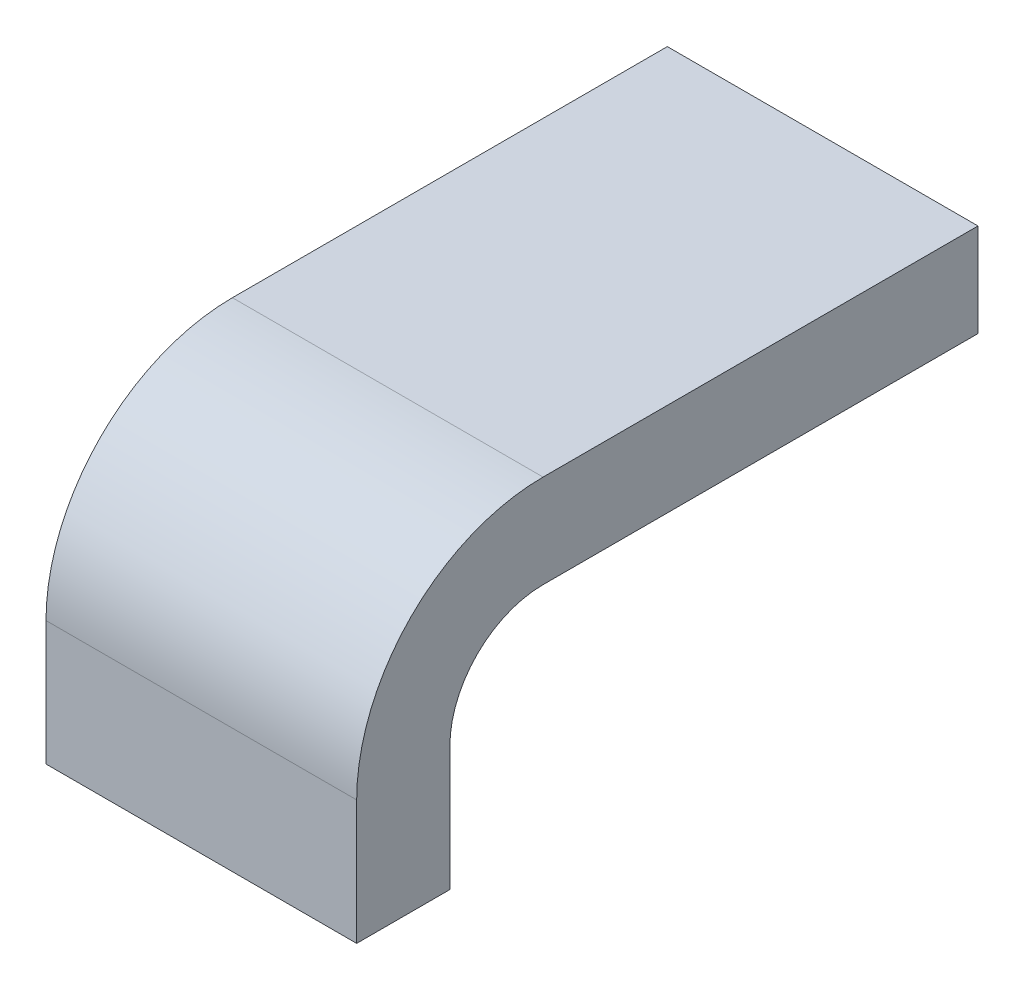
ISO-10303-21;
HEADER;
FILE_DESCRIPTION(('STEP AP214'),'2;1');
FILE_NAME('part.step','',(''),(''),'','','');
FILE_SCHEMA(('AUTOMOTIVE_DESIGN { 1 0 10303 214 1 1 1 1 }'));
ENDSEC;
DATA;
#1=APPLICATION_CONTEXT('core data for automotive mechanical design processes');
#2=APPLICATION_PROTOCOL_DEFINITION('international standard','automotive_design',2000,#1);
#3=PRODUCT_CONTEXT('',#1,'mechanical');
#4=PRODUCT('Part','Part','',(#3));
#5=PRODUCT_RELATED_PRODUCT_CATEGORY('part','',(#4));
#6=PRODUCT_DEFINITION_FORMATION('','',#4);
#7=PRODUCT_DEFINITION_CONTEXT('part definition',#1,'design');
#8=PRODUCT_DEFINITION('design','',#6,#7);
#9=PRODUCT_DEFINITION_SHAPE('','',#8);
#10=(LENGTH_UNIT() NAMED_UNIT(*) SI_UNIT(.MILLI.,.METRE.));
#11=(NAMED_UNIT(*) PLANE_ANGLE_UNIT() SI_UNIT($,.RADIAN.));
#12=(NAMED_UNIT(*) SI_UNIT($,.STERADIAN.) SOLID_ANGLE_UNIT());
#13=UNCERTAINTY_MEASURE_WITH_UNIT(LENGTH_MEASURE(1.E-05),#10,'distance_accuracy_value','');
#14=(GEOMETRIC_REPRESENTATION_CONTEXT(3) GLOBAL_UNCERTAINTY_ASSIGNED_CONTEXT((#13)) GLOBAL_UNIT_ASSIGNED_CONTEXT((#10,
#11,#12)) REPRESENTATION_CONTEXT('',''));
#15=CARTESIAN_POINT('',(0.,0.,0.));
#16=DIRECTION('',(0.,0.,1.));
#17=DIRECTION('',(1.,0.,0.));
#18=AXIS2_PLACEMENT_3D('',#15,#16,#17);
#19=CARTESIAN_POINT('',(5.,2.28436018957346,-5.260663507109));
#20=DIRECTION('',(0.,0.,1.));
#21=DIRECTION('',(1.,0.,0.));
#22=AXIS2_PLACEMENT_3D('',#19,#20,#21);
#23=PLANE('',#22);
#24=DIRECTION('',(0.,1.,0.));
#25=VECTOR('',#24,1.);
#26=CARTESIAN_POINT('',(-5.,2.28436018957346,-5.260663507109));
#27=LINE('',#26,#25);
#28=CARTESIAN_POINT('',(-5.,2.28436018957346,-5.260663507109));
#29=VERTEX_POINT('',#28);
#30=CARTESIAN_POINT('',(-5.,5.28436018957346,-5.260663507109));
#31=VERTEX_POINT('',#30);
#32=EDGE_CURVE('E128',#29,#31,#27,.T.);
#33=ORIENTED_EDGE('',*,*,#32,.T.);
#34=DIRECTION('',(-1.,0.,0.));
#35=VECTOR('',#34,1.);
#36=CARTESIAN_POINT('',(5.,5.28436018957346,-5.260663507109));
#37=LINE('',#36,#35);
#38=CARTESIAN_POINT('',(5.,5.28436018957346,-5.260663507109));
#39=VERTEX_POINT('',#38);
#40=EDGE_CURVE('E11',#39,#31,#37,.T.);
#41=ORIENTED_EDGE('',*,*,#40,.F.);
#42=DIRECTION('',(0.,1.,0.));
#43=VECTOR('',#42,1.);
#44=CARTESIAN_POINT('',(5.,2.28436018957346,-5.260663507109));
#45=LINE('',#44,#43);
#46=CARTESIAN_POINT('',(5.,2.28436018957346,-5.260663507109));
#47=VERTEX_POINT('',#46);
#48=EDGE_CURVE('E143',#47,#39,#45,.T.);
#49=ORIENTED_EDGE('',*,*,#48,.F.);
#50=DIRECTION('',(-1.,0.,0.));
#51=VECTOR('',#50,1.);
#52=CARTESIAN_POINT('',(5.,2.28436018957346,-5.260663507109));
#53=LINE('',#52,#51);
#54=EDGE_CURVE('E124',#47,#29,#53,.T.);
#55=ORIENTED_EDGE('',*,*,#54,.T.);
#56=EDGE_LOOP('',(#33,#41,#49,#55));
#57=FACE_BOUND('',#56,.T.);
#58=ADVANCED_FACE('F33',(#57),#23,.F.);
#59=CARTESIAN_POINT('',(5.,5.28436018957346,-5.260663507109));
#60=DIRECTION('',(0.,-1.,0.));
#61=DIRECTION('',(0.,0.,-1.));
#62=AXIS2_PLACEMENT_3D('',#59,#60,#61);
#63=PLANE('',#62);
#64=DIRECTION('',(0.,0.,1.));
#65=VECTOR('',#64,1.);
#66=CARTESIAN_POINT('',(-5.,5.28436018957346,-5.260663507109));
#67=LINE('',#66,#65);
#68=CARTESIAN_POINT('',(-5.,5.28436018957346,8.73933649289096));
#69=VERTEX_POINT('',#68);
#70=EDGE_CURVE('E131',#31,#69,#67,.T.);
#71=ORIENTED_EDGE('',*,*,#70,.T.);
#72=DIRECTION('',(-1.,0.,0.));
#73=VECTOR('',#72,1.);
#74=CARTESIAN_POINT('',(5.,5.28436018957346,8.73933649289096));
#75=LINE('',#74,#73);
#76=CARTESIAN_POINT('',(5.,5.28436018957346,8.73933649289096));
#77=VERTEX_POINT('',#76);
#78=EDGE_CURVE('E41',#77,#69,#75,.T.);
#79=ORIENTED_EDGE('',*,*,#78,.F.);
#80=DIRECTION('',(0.,0.,1.));
#81=VECTOR('',#80,1.);
#82=CARTESIAN_POINT('',(5.,5.28436018957346,-5.260663507109));
#83=LINE('',#82,#81);
#84=EDGE_CURVE('E88',#39,#77,#83,.T.);
#85=ORIENTED_EDGE('',*,*,#84,.F.);
#86=ORIENTED_EDGE('',*,*,#40,.T.);
#87=EDGE_LOOP('',(#71,#79,#85,#86));
#88=FACE_BOUND('',#87,.T.);
#89=ADVANCED_FACE('F178',(#88),#63,.F.);
#90=CARTESIAN_POINT('',(5.,-0.715639810426541,8.739336492891));
#91=DIRECTION('',(-1.,0.,0.));
#92=DIRECTION('',(0.,0.,1.));
#93=AXIS2_PLACEMENT_3D('',#90,#91,#92);
#94=CYLINDRICAL_SURFACE('',#93,6.);
#95=CARTESIAN_POINT('',(-5.,-0.715639810426541,8.739336492891));
#96=DIRECTION('',(1.,0.,0.));
#97=DIRECTION('',(0.,0.,-1.));
#98=AXIS2_PLACEMENT_3D('',#95,#96,#97);
#99=CIRCLE('',#98,6.);
#100=CARTESIAN_POINT('',(-5.,-0.715639810426583,14.739336492891));
#101=VERTEX_POINT('',#100);
#102=EDGE_CURVE('E133',#69,#101,#99,.T.);
#103=ORIENTED_EDGE('',*,*,#102,.T.);
#104=DIRECTION('',(-1.,0.,0.));
#105=VECTOR('',#104,1.);
#106=CARTESIAN_POINT('',(5.,-0.715639810426583,14.739336492891));
#107=LINE('',#106,#105);
#108=CARTESIAN_POINT('',(5.,-0.715639810426583,14.739336492891));
#109=VERTEX_POINT('',#108);
#110=EDGE_CURVE('E150',#109,#101,#107,.T.);
#111=ORIENTED_EDGE('',*,*,#110,.F.);
#112=CARTESIAN_POINT('',(5.,-0.715639810426541,8.739336492891));
#113=DIRECTION('',(1.,0.,0.));
#114=DIRECTION('',(0.,0.,-1.));
#115=AXIS2_PLACEMENT_3D('',#112,#113,#114);
#116=CIRCLE('',#115,6.);
#117=EDGE_CURVE('E158',#77,#109,#116,.T.);
#118=ORIENTED_EDGE('',*,*,#117,.F.);
#119=ORIENTED_EDGE('',*,*,#78,.T.);
#120=EDGE_LOOP('',(#103,#111,#118,#119));
#121=FACE_BOUND('',#120,.T.);
#122=ADVANCED_FACE('F156',(#121),#94,.T.);
#123=CARTESIAN_POINT('',(5.,-0.715639810426584,14.739336492891));
#124=DIRECTION('',(0.,0.,-1.));
#125=DIRECTION('',(-1.,0.,0.));
#126=AXIS2_PLACEMENT_3D('',#123,#124,#125);
#127=PLANE('',#126);
#128=DIRECTION('',(0.,-1.,0.));
#129=VECTOR('',#128,1.);
#130=CARTESIAN_POINT('',(-5.,-0.715639810426584,14.739336492891));
#131=LINE('',#130,#129);
#132=CARTESIAN_POINT('',(-5.,-4.71563981042654,14.739336492891));
#133=VERTEX_POINT('',#132);
#134=EDGE_CURVE('E135',#101,#133,#131,.T.);
#135=ORIENTED_EDGE('',*,*,#134,.T.);
#136=DIRECTION('',(-1.,0.,0.));
#137=VECTOR('',#136,1.);
#138=CARTESIAN_POINT('',(5.,-4.71563981042654,14.739336492891));
#139=LINE('',#138,#137);
#140=CARTESIAN_POINT('',(5.,-4.71563981042654,14.739336492891));
#141=VERTEX_POINT('',#140);
#142=EDGE_CURVE('E147',#141,#133,#139,.T.);
#143=ORIENTED_EDGE('',*,*,#142,.F.);
#144=DIRECTION('',(0.,-1.,0.));
#145=VECTOR('',#144,1.);
#146=CARTESIAN_POINT('',(5.,-0.715639810426584,14.739336492891));
#147=LINE('',#146,#145);
#148=EDGE_CURVE('E170',#109,#141,#147,.T.);
#149=ORIENTED_EDGE('',*,*,#148,.F.);
#150=ORIENTED_EDGE('',*,*,#110,.T.);
#151=EDGE_LOOP('',(#135,#143,#149,#150));
#152=FACE_BOUND('',#151,.T.);
#153=ADVANCED_FACE('F166',(#152),#127,.F.);
#154=CARTESIAN_POINT('',(5.,-4.71563981042654,14.739336492891));
#155=DIRECTION('',(0.,1.,0.));
#156=DIRECTION('',(0.,0.,1.));
#157=AXIS2_PLACEMENT_3D('',#154,#155,#156);
#158=PLANE('',#157);
#159=DIRECTION('',(0.,0.,-1.));
#160=VECTOR('',#159,1.);
#161=CARTESIAN_POINT('',(-5.,-4.71563981042654,14.739336492891));
#162=LINE('',#161,#160);
#163=CARTESIAN_POINT('',(-5.,-4.71563981042654,11.739336492891));
#164=VERTEX_POINT('',#163);
#165=EDGE_CURVE('E137',#133,#164,#162,.T.);
#166=ORIENTED_EDGE('',*,*,#165,.T.);
#167=DIRECTION('',(-1.,0.,0.));
#168=VECTOR('',#167,1.);
#169=CARTESIAN_POINT('',(5.,-4.71563981042654,11.739336492891));
#170=LINE('',#169,#168);
#171=CARTESIAN_POINT('',(5.,-4.71563981042654,11.739336492891));
#172=VERTEX_POINT('',#171);
#173=EDGE_CURVE('E120',#172,#164,#170,.T.);
#174=ORIENTED_EDGE('',*,*,#173,.F.);
#175=DIRECTION('',(0.,0.,-1.));
#176=VECTOR('',#175,1.);
#177=CARTESIAN_POINT('',(5.,-4.71563981042654,14.739336492891));
#178=LINE('',#177,#176);
#179=EDGE_CURVE('E107',#141,#172,#178,.T.);
#180=ORIENTED_EDGE('',*,*,#179,.F.);
#181=ORIENTED_EDGE('',*,*,#142,.T.);
#182=EDGE_LOOP('',(#166,#174,#180,#181));
#183=FACE_BOUND('',#182,.T.);
#184=ADVANCED_FACE('F169',(#183),#158,.F.);
#185=CARTESIAN_POINT('',(5.,-4.71563981042654,11.739336492891));
#186=DIRECTION('',(0.,0.,1.));
#187=DIRECTION('',(0.,-1.,0.));
#188=AXIS2_PLACEMENT_3D('',#185,#186,#187);
#189=PLANE('',#188);
#190=DIRECTION('',(0.,1.,0.));
#191=VECTOR('',#190,1.);
#192=CARTESIAN_POINT('',(-5.,-4.71563981042654,11.739336492891));
#193=LINE('',#192,#191);
#194=CARTESIAN_POINT('',(-5.,-0.715639810426539,11.739336492891));
#195=VERTEX_POINT('',#194);
#196=EDGE_CURVE('E116',#164,#195,#193,.T.);
#197=ORIENTED_EDGE('',*,*,#196,.T.);
#198=DIRECTION('',(-1.,0.,0.));
#199=VECTOR('',#198,1.);
#200=CARTESIAN_POINT('',(5.,-0.715639810426539,11.739336492891));
#201=LINE('',#200,#199);
#202=CARTESIAN_POINT('',(5.,-0.715639810426539,11.739336492891));
#203=VERTEX_POINT('',#202);
#204=EDGE_CURVE('E113',#203,#195,#201,.T.);
#205=ORIENTED_EDGE('',*,*,#204,.F.);
#206=DIRECTION('',(0.,1.,0.));
#207=VECTOR('',#206,1.);
#208=CARTESIAN_POINT('',(5.,-4.71563981042654,11.739336492891));
#209=LINE('',#208,#207);
#210=EDGE_CURVE('E101',#172,#203,#209,.T.);
#211=ORIENTED_EDGE('',*,*,#210,.F.);
#212=ORIENTED_EDGE('',*,*,#173,.T.);
#213=EDGE_LOOP('',(#197,#205,#211,#212));
#214=FACE_BOUND('',#213,.T.);
#215=ADVANCED_FACE('F114',(#214),#189,.F.);
#216=CARTESIAN_POINT('',(5.,-0.715639810426539,8.739336492891));
#217=DIRECTION('',(-1.,0.,0.));
#218=DIRECTION('',(0.,0.,1.));
#219=AXIS2_PLACEMENT_3D('',#216,#217,#218);
#220=CYLINDRICAL_SURFACE('',#219,3.);
#221=CARTESIAN_POINT('',(-5.,-0.715639810426539,8.739336492891));
#222=DIRECTION('',(1.,0.,0.));
#223=DIRECTION('',(0.,0.,-1.));
#224=AXIS2_PLACEMENT_3D('',#221,#222,#223);
#225=CIRCLE('',#224,3.);
#226=CARTESIAN_POINT('',(-5.,2.28436018957346,8.739336492891));
#227=VERTEX_POINT('',#226);
#228=EDGE_CURVE('E140',#227,#195,#225,.T.);
#229=ORIENTED_EDGE('',*,*,#228,.F.);
#230=DIRECTION('',(-1.,0.,0.));
#231=VECTOR('',#230,1.);
#232=CARTESIAN_POINT('',(5.,2.28436018957346,8.739336492891));
#233=LINE('',#232,#231);
#234=CARTESIAN_POINT('',(5.,2.28436018957346,8.739336492891));
#235=VERTEX_POINT('',#234);
#236=EDGE_CURVE('E77',#235,#227,#233,.T.);
#237=ORIENTED_EDGE('',*,*,#236,.F.);
#238=CARTESIAN_POINT('',(5.,-0.715639810426539,8.739336492891));
#239=DIRECTION('',(1.,0.,0.));
#240=DIRECTION('',(0.,0.,-1.));
#241=AXIS2_PLACEMENT_3D('',#238,#239,#240);
#242=CIRCLE('',#241,3.);
#243=EDGE_CURVE('E105',#235,#203,#242,.T.);
#244=ORIENTED_EDGE('',*,*,#243,.T.);
#245=ORIENTED_EDGE('',*,*,#204,.T.);
#246=EDGE_LOOP('',(#229,#237,#244,#245));
#247=FACE_BOUND('',#246,.T.);
#248=ADVANCED_FACE('F122',(#247),#220,.F.);
#249=CARTESIAN_POINT('',(5.,2.28436018957346,8.739336492891));
#250=DIRECTION('',(0.,1.,0.));
#251=DIRECTION('',(0.,0.,1.));
#252=AXIS2_PLACEMENT_3D('',#249,#250,#251);
#253=PLANE('',#252);
#254=DIRECTION('',(0.,0.,-1.));
#255=VECTOR('',#254,1.);
#256=CARTESIAN_POINT('',(-5.,2.28436018957346,8.739336492891));
#257=LINE('',#256,#255);
#258=EDGE_CURVE('E80',#227,#29,#257,.T.);
#259=ORIENTED_EDGE('',*,*,#258,.T.);
#260=ORIENTED_EDGE('',*,*,#54,.F.);
#261=DIRECTION('',(0.,0.,-1.));
#262=VECTOR('',#261,1.);
#263=CARTESIAN_POINT('',(5.,2.28436018957346,8.739336492891));
#264=LINE('',#263,#262);
#265=EDGE_CURVE('E49',#235,#47,#264,.T.);
#266=ORIENTED_EDGE('',*,*,#265,.F.);
#267=ORIENTED_EDGE('',*,*,#236,.T.);
#268=EDGE_LOOP('',(#259,#260,#266,#267));
#269=FACE_BOUND('',#268,.T.);
#270=ADVANCED_FACE('F194',(#269),#253,.F.);
#271=CARTESIAN_POINT('',(5.,-0.715639810426541,8.739336492891));
#272=DIRECTION('',(1.,0.,0.));
#273=DIRECTION('',(0.,0.,-1.));
#274=AXIS2_PLACEMENT_3D('',#271,#272,#273);
#275=PLANE('',#274);
#276=ORIENTED_EDGE('',*,*,#48,.T.);
#277=ORIENTED_EDGE('',*,*,#84,.T.);
#278=ORIENTED_EDGE('',*,*,#117,.T.);
#279=ORIENTED_EDGE('',*,*,#148,.T.);
#280=ORIENTED_EDGE('',*,*,#179,.T.);
#281=ORIENTED_EDGE('',*,*,#210,.T.);
#282=ORIENTED_EDGE('',*,*,#243,.F.);
#283=ORIENTED_EDGE('',*,*,#265,.T.);
#284=EDGE_LOOP('',(#276,#277,#278,#279,#280,#281,#282,#283));
#285=FACE_BOUND('',#284,.T.);
#286=ADVANCED_FACE('F103',(#285),#275,.T.);
#287=CARTESIAN_POINT('',(-5.,-0.715639810426541,8.739336492891));
#288=DIRECTION('',(1.,0.,0.));
#289=DIRECTION('',(0.,0.,-1.));
#290=AXIS2_PLACEMENT_3D('',#287,#288,#289);
#291=PLANE('',#290);
#292=ORIENTED_EDGE('',*,*,#32,.F.);
#293=ORIENTED_EDGE('',*,*,#258,.F.);
#294=ORIENTED_EDGE('',*,*,#228,.T.);
#295=ORIENTED_EDGE('',*,*,#196,.F.);
#296=ORIENTED_EDGE('',*,*,#165,.F.);
#297=ORIENTED_EDGE('',*,*,#134,.F.);
#298=ORIENTED_EDGE('',*,*,#102,.F.);
#299=ORIENTED_EDGE('',*,*,#70,.F.);
#300=EDGE_LOOP('',(#292,#293,#294,#295,#296,#297,#298,#299));
#301=FACE_BOUND('',#300,.T.);
#302=ADVANCED_FACE('F162',(#301),#291,.F.);
#303=CLOSED_SHELL('',(#58,#89,#122,#153,#184,#215,#248,#270,#286,#302));
#304=MANIFOLD_SOLID_BREP('B2',#303);
#305=ADVANCED_BREP_SHAPE_REPRESENTATION('',(#18,#304),#14);
#306=SHAPE_DEFINITION_REPRESENTATION(#9,#305);
ENDSEC;
END-ISO-10303-21;
